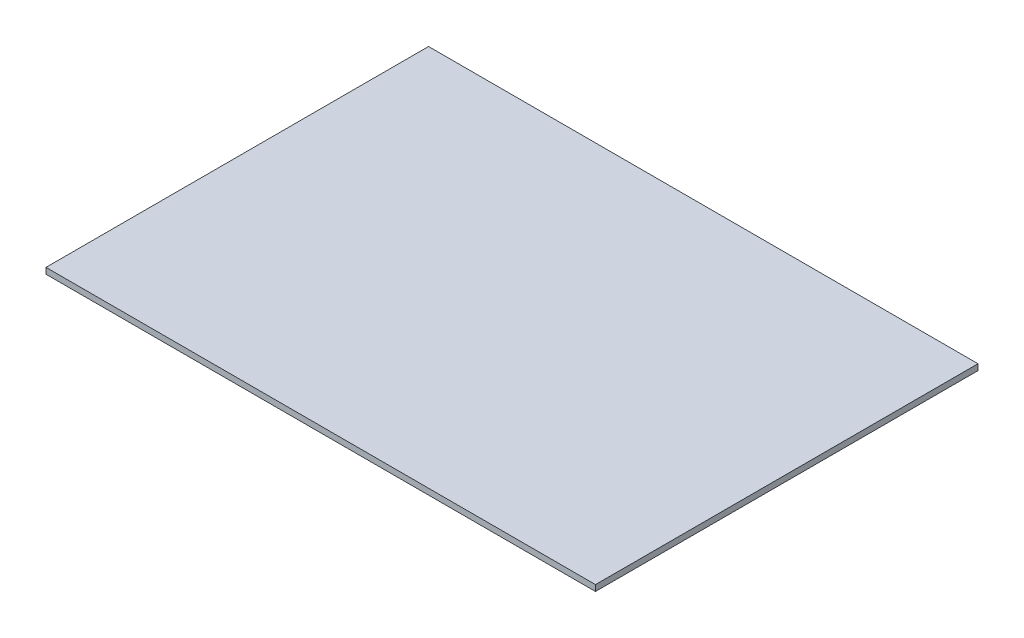
ISO-10303-21;
HEADER;
FILE_DESCRIPTION(('STEP AP214'),'2;1');
FILE_NAME('part.step','',(''),(''),'','','');
FILE_SCHEMA(('AUTOMOTIVE_DESIGN { 1 0 10303 214 1 1 1 1 }'));
ENDSEC;
DATA;
#1=APPLICATION_CONTEXT('core data for automotive mechanical design processes');
#2=APPLICATION_PROTOCOL_DEFINITION('international standard','automotive_design',2000,#1);
#3=PRODUCT_CONTEXT('',#1,'mechanical');
#4=PRODUCT('Part','Part','',(#3));
#5=PRODUCT_RELATED_PRODUCT_CATEGORY('part','',(#4));
#6=PRODUCT_DEFINITION_FORMATION('','',#4);
#7=PRODUCT_DEFINITION_CONTEXT('part definition',#1,'design');
#8=PRODUCT_DEFINITION('design','',#6,#7);
#9=PRODUCT_DEFINITION_SHAPE('','',#8);
#10=(LENGTH_UNIT() NAMED_UNIT(*) SI_UNIT(.MILLI.,.METRE.));
#11=(NAMED_UNIT(*) PLANE_ANGLE_UNIT() SI_UNIT($,.RADIAN.));
#12=(NAMED_UNIT(*) SI_UNIT($,.STERADIAN.) SOLID_ANGLE_UNIT());
#13=UNCERTAINTY_MEASURE_WITH_UNIT(LENGTH_MEASURE(1.E-05),#10,'distance_accuracy_value','');
#14=(GEOMETRIC_REPRESENTATION_CONTEXT(3) GLOBAL_UNCERTAINTY_ASSIGNED_CONTEXT((#13)) GLOBAL_UNIT_ASSIGNED_CONTEXT((#10,
#11,#12)) REPRESENTATION_CONTEXT('',''));
#15=CARTESIAN_POINT('',(0.,0.,0.));
#16=DIRECTION('',(0.,0.,1.));
#17=DIRECTION('',(1.,0.,0.));
#18=AXIS2_PLACEMENT_3D('',#15,#16,#17);
#19=CARTESIAN_POINT('',(0.,-1.8,0.));
#20=DIRECTION('',(-1.,0.,0.));
#21=DIRECTION('',(0.,0.,1.));
#22=AXIS2_PLACEMENT_3D('',#19,#20,#21);
#23=PLANE('',#22);
#24=DIRECTION('',(0.,0.,1.));
#25=VECTOR('',#24,1.);
#26=CARTESIAN_POINT('',(0.,0.,0.));
#27=LINE('',#26,#25);
#28=CARTESIAN_POINT('',(0.,0.,-114.94));
#29=VERTEX_POINT('',#28);
#30=CARTESIAN_POINT('',(0.,0.,0.));
#31=VERTEX_POINT('',#30);
#32=EDGE_CURVE('E111',#29,#31,#27,.T.);
#33=ORIENTED_EDGE('',*,*,#32,.F.);
#34=DIRECTION('',(0.,1.,0.));
#35=VECTOR('',#34,1.);
#36=CARTESIAN_POINT('',(0.,-1.8,-114.94));
#37=LINE('',#36,#35);
#38=CARTESIAN_POINT('',(0.,-1.8,-114.94));
#39=VERTEX_POINT('',#38);
#40=EDGE_CURVE('E11',#39,#29,#37,.T.);
#41=ORIENTED_EDGE('',*,*,#40,.F.);
#42=DIRECTION('',(0.,0.,1.));
#43=VECTOR('',#42,1.);
#44=CARTESIAN_POINT('',(0.,-1.8,0.));
#45=LINE('',#44,#43);
#46=CARTESIAN_POINT('',(0.,-1.8,0.));
#47=VERTEX_POINT('',#46);
#48=EDGE_CURVE('E105',#39,#47,#45,.T.);
#49=ORIENTED_EDGE('',*,*,#48,.T.);
#50=DIRECTION('',(0.,1.,0.));
#51=VECTOR('',#50,1.);
#52=CARTESIAN_POINT('',(0.,-1.8,0.));
#53=LINE('',#52,#51);
#54=EDGE_CURVE('E50',#47,#31,#53,.T.);
#55=ORIENTED_EDGE('',*,*,#54,.T.);
#56=EDGE_LOOP('',(#33,#41,#49,#55));
#57=FACE_BOUND('',#56,.T.);
#58=ADVANCED_FACE('F47',(#57),#23,.T.);
#59=CARTESIAN_POINT('',(0.,-1.8,-114.94));
#60=DIRECTION('',(0.,0.,-1.));
#61=DIRECTION('',(-1.,0.,0.));
#62=AXIS2_PLACEMENT_3D('',#59,#60,#61);
#63=PLANE('',#62);
#64=DIRECTION('',(-1.,0.,0.));
#65=VECTOR('',#64,1.);
#66=CARTESIAN_POINT('',(0.,0.,-114.94));
#67=LINE('',#66,#65);
#68=CARTESIAN_POINT('',(165.1,0.,-114.94));
#69=VERTEX_POINT('',#68);
#70=EDGE_CURVE('E107',#69,#29,#67,.T.);
#71=ORIENTED_EDGE('',*,*,#70,.F.);
#72=DIRECTION('',(0.,1.,0.));
#73=VECTOR('',#72,1.);
#74=CARTESIAN_POINT('',(165.1,-1.8,-114.94));
#75=LINE('',#74,#73);
#76=CARTESIAN_POINT('',(165.1,-1.8,-114.94));
#77=VERTEX_POINT('',#76);
#78=EDGE_CURVE('E56',#77,#69,#75,.T.);
#79=ORIENTED_EDGE('',*,*,#78,.F.);
#80=DIRECTION('',(-1.,0.,0.));
#81=VECTOR('',#80,1.);
#82=CARTESIAN_POINT('',(0.,-1.8,-114.94));
#83=LINE('',#82,#81);
#84=EDGE_CURVE('E102',#77,#39,#83,.T.);
#85=ORIENTED_EDGE('',*,*,#84,.T.);
#86=ORIENTED_EDGE('',*,*,#40,.T.);
#87=EDGE_LOOP('',(#71,#79,#85,#86));
#88=FACE_BOUND('',#87,.T.);
#89=ADVANCED_FACE('F121',(#88),#63,.T.);
#90=CARTESIAN_POINT('',(165.1,-1.8,0.));
#91=DIRECTION('',(1.,0.,0.));
#92=DIRECTION('',(0.,0.,-1.));
#93=AXIS2_PLACEMENT_3D('',#90,#91,#92);
#94=PLANE('',#93);
#95=DIRECTION('',(0.,0.,-1.));
#96=VECTOR('',#95,1.);
#97=CARTESIAN_POINT('',(165.1,0.,0.));
#98=LINE('',#97,#96);
#99=CARTESIAN_POINT('',(165.1,0.,0.));
#100=VERTEX_POINT('',#99);
#101=EDGE_CURVE('E97',#100,#69,#98,.T.);
#102=ORIENTED_EDGE('',*,*,#101,.F.);
#103=DIRECTION('',(0.,1.,0.));
#104=VECTOR('',#103,1.);
#105=CARTESIAN_POINT('',(165.1,-1.8,0.));
#106=LINE('',#105,#104);
#107=CARTESIAN_POINT('',(165.1,-1.8,0.));
#108=VERTEX_POINT('',#107);
#109=EDGE_CURVE('E92',#108,#100,#106,.T.);
#110=ORIENTED_EDGE('',*,*,#109,.F.);
#111=DIRECTION('',(0.,0.,-1.));
#112=VECTOR('',#111,1.);
#113=CARTESIAN_POINT('',(165.1,-1.8,0.));
#114=LINE('',#113,#112);
#115=EDGE_CURVE('E95',#108,#77,#114,.T.);
#116=ORIENTED_EDGE('',*,*,#115,.T.);
#117=ORIENTED_EDGE('',*,*,#78,.T.);
#118=EDGE_LOOP('',(#102,#110,#116,#117));
#119=FACE_BOUND('',#118,.T.);
#120=ADVANCED_FACE('F94',(#119),#94,.T.);
#121=CARTESIAN_POINT('',(0.,-1.8,0.));
#122=DIRECTION('',(0.,0.,1.));
#123=DIRECTION('',(1.,0.,0.));
#124=AXIS2_PLACEMENT_3D('',#121,#122,#123);
#125=PLANE('',#124);
#126=DIRECTION('',(1.,0.,0.));
#127=VECTOR('',#126,1.);
#128=CARTESIAN_POINT('',(0.,0.,0.));
#129=LINE('',#128,#127);
#130=EDGE_CURVE('E114',#31,#100,#129,.T.);
#131=ORIENTED_EDGE('',*,*,#130,.F.);
#132=ORIENTED_EDGE('',*,*,#54,.F.);
#133=DIRECTION('',(1.,0.,0.));
#134=VECTOR('',#133,1.);
#135=CARTESIAN_POINT('',(0.,-1.8,0.));
#136=LINE('',#135,#134);
#137=EDGE_CURVE('E101',#47,#108,#136,.T.);
#138=ORIENTED_EDGE('',*,*,#137,.T.);
#139=ORIENTED_EDGE('',*,*,#109,.T.);
#140=EDGE_LOOP('',(#131,#132,#138,#139));
#141=FACE_BOUND('',#140,.T.);
#142=ADVANCED_FACE('F104',(#141),#125,.T.);
#143=CARTESIAN_POINT('',(0.,-1.8,-114.94));
#144=DIRECTION('',(0.,-1.,0.));
#145=DIRECTION('',(0.,0.,-1.));
#146=AXIS2_PLACEMENT_3D('',#143,#144,#145);
#147=PLANE('',#146);
#148=ORIENTED_EDGE('',*,*,#48,.F.);
#149=ORIENTED_EDGE('',*,*,#84,.F.);
#150=ORIENTED_EDGE('',*,*,#115,.F.);
#151=ORIENTED_EDGE('',*,*,#137,.F.);
#152=EDGE_LOOP('',(#148,#149,#150,#151));
#153=FACE_BOUND('',#152,.T.);
#154=ADVANCED_FACE('F100',(#153),#147,.T.);
#155=CARTESIAN_POINT('',(0.,0.,-114.94));
#156=DIRECTION('',(0.,-1.,0.));
#157=DIRECTION('',(0.,0.,-1.));
#158=AXIS2_PLACEMENT_3D('',#155,#156,#157);
#159=PLANE('',#158);
#160=ORIENTED_EDGE('',*,*,#32,.T.);
#161=ORIENTED_EDGE('',*,*,#130,.T.);
#162=ORIENTED_EDGE('',*,*,#101,.T.);
#163=ORIENTED_EDGE('',*,*,#70,.T.);
#164=EDGE_LOOP('',(#160,#161,#162,#163));
#165=FACE_BOUND('',#164,.T.);
#166=ADVANCED_FACE('F120',(#165),#159,.F.);
#167=CLOSED_SHELL('',(#58,#89,#120,#142,#154,#166));
#168=MANIFOLD_SOLID_BREP('B2',#167);
#169=ADVANCED_BREP_SHAPE_REPRESENTATION('',(#18,#168),#14);
#170=SHAPE_DEFINITION_REPRESENTATION(#9,#169);
ENDSEC;
END-ISO-10303-21;
